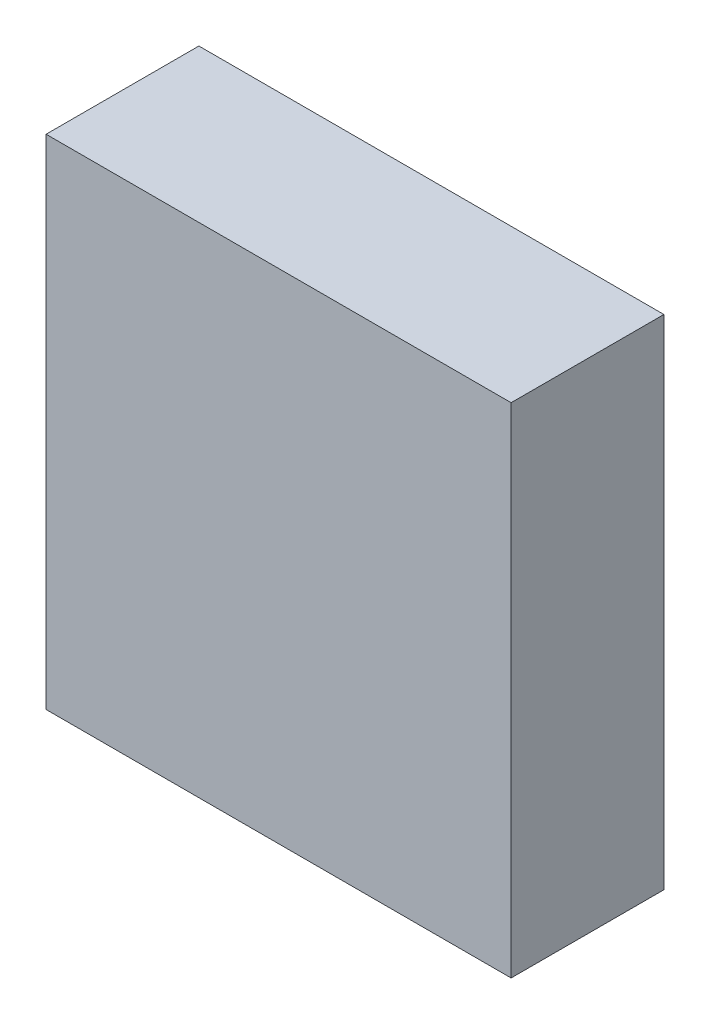
ISO-10303-21;
HEADER;
FILE_DESCRIPTION(('STEP AP214'),'2;1');
FILE_NAME('part.step','',(''),(''),'','','');
FILE_SCHEMA(('AUTOMOTIVE_DESIGN { 1 0 10303 214 1 1 1 1 }'));
ENDSEC;
DATA;
#1=APPLICATION_CONTEXT('core data for automotive mechanical design processes');
#2=APPLICATION_PROTOCOL_DEFINITION('international standard','automotive_design',2000,#1);
#3=PRODUCT_CONTEXT('',#1,'mechanical');
#4=PRODUCT('Part','Part','',(#3));
#5=PRODUCT_RELATED_PRODUCT_CATEGORY('part','',(#4));
#6=PRODUCT_DEFINITION_FORMATION('','',#4);
#7=PRODUCT_DEFINITION_CONTEXT('part definition',#1,'design');
#8=PRODUCT_DEFINITION('design','',#6,#7);
#9=PRODUCT_DEFINITION_SHAPE('','',#8);
#10=(LENGTH_UNIT() NAMED_UNIT(*) SI_UNIT(.MILLI.,.METRE.));
#11=(NAMED_UNIT(*) PLANE_ANGLE_UNIT() SI_UNIT($,.RADIAN.));
#12=(NAMED_UNIT(*) SI_UNIT($,.STERADIAN.) SOLID_ANGLE_UNIT());
#13=UNCERTAINTY_MEASURE_WITH_UNIT(LENGTH_MEASURE(1.E-05),#10,'distance_accuracy_value','');
#14=(GEOMETRIC_REPRESENTATION_CONTEXT(3) GLOBAL_UNCERTAINTY_ASSIGNED_CONTEXT((#13)) GLOBAL_UNIT_ASSIGNED_CONTEXT((#10,
#11,#12)) REPRESENTATION_CONTEXT('',''));
#15=CARTESIAN_POINT('',(0.,0.,0.));
#16=DIRECTION('',(0.,0.,1.));
#17=DIRECTION('',(1.,0.,0.));
#18=AXIS2_PLACEMENT_3D('',#15,#16,#17);
#19=CARTESIAN_POINT('',(-70.6631905284082,65.8326689774697,23.));
#20=DIRECTION('',(1.,0.,0.));
#21=DIRECTION('',(0.,1.,0.));
#22=AXIS2_PLACEMENT_3D('',#19,#20,#21);
#23=PLANE('',#22);
#24=DIRECTION('',(0.,-1.,0.));
#25=VECTOR('',#24,1.);
#26=CARTESIAN_POINT('',(-70.6631905284082,65.8326689774697,0.));
#27=LINE('',#26,#25);
#28=CARTESIAN_POINT('',(-70.6631905284082,65.8326689774697,0.));
#29=VERTEX_POINT('',#28);
#30=CARTESIAN_POINT('',(-70.6631905284081,-9.16733102253033,0.));
#31=VERTEX_POINT('',#30);
#32=EDGE_CURVE('E99',#29,#31,#27,.T.);
#33=ORIENTED_EDGE('',*,*,#32,.T.);
#34=DIRECTION('',(0.,0.,-1.));
#35=VECTOR('',#34,1.);
#36=CARTESIAN_POINT('',(-70.6631905284081,-9.16733102253033,23.));
#37=LINE('',#36,#35);
#38=CARTESIAN_POINT('',(-70.6631905284081,-9.16733102253033,23.));
#39=VERTEX_POINT('',#38);
#40=EDGE_CURVE('E11',#39,#31,#37,.T.);
#41=ORIENTED_EDGE('',*,*,#40,.F.);
#42=DIRECTION('',(0.,-1.,0.));
#43=VECTOR('',#42,1.);
#44=CARTESIAN_POINT('',(-70.6631905284082,65.8326689774697,23.));
#45=LINE('',#44,#43);
#46=CARTESIAN_POINT('',(-70.6631905284082,65.8326689774697,23.));
#47=VERTEX_POINT('',#46);
#48=EDGE_CURVE('E87',#47,#39,#45,.T.);
#49=ORIENTED_EDGE('',*,*,#48,.F.);
#50=DIRECTION('',(0.,0.,-1.));
#51=VECTOR('',#50,1.);
#52=CARTESIAN_POINT('',(-70.6631905284082,65.8326689774697,23.));
#53=LINE('',#52,#51);
#54=EDGE_CURVE('E95',#47,#29,#53,.T.);
#55=ORIENTED_EDGE('',*,*,#54,.T.);
#56=EDGE_LOOP('',(#33,#41,#49,#55));
#57=FACE_BOUND('',#56,.T.);
#58=ADVANCED_FACE('F36',(#57),#23,.F.);
#59=CARTESIAN_POINT('',(-70.6631905284081,-9.16733102253033,23.));
#60=DIRECTION('',(0.,1.,0.));
#61=DIRECTION('',(0.,0.,1.));
#62=AXIS2_PLACEMENT_3D('',#59,#60,#61);
#63=PLANE('',#62);
#64=DIRECTION('',(1.,0.,0.));
#65=VECTOR('',#64,1.);
#66=CARTESIAN_POINT('',(-70.6631905284081,-9.16733102253033,0.));
#67=LINE('',#66,#65);
#68=CARTESIAN_POINT('',(-0.663190528408131,-9.16733102253033,0.));
#69=VERTEX_POINT('',#68);
#70=EDGE_CURVE('E91',#31,#69,#67,.T.);
#71=ORIENTED_EDGE('',*,*,#70,.T.);
#72=DIRECTION('',(0.,0.,-1.));
#73=VECTOR('',#72,1.);
#74=CARTESIAN_POINT('',(-0.663190528408131,-9.16733102253033,23.));
#75=LINE('',#74,#73);
#76=CARTESIAN_POINT('',(-0.663190528408131,-9.16733102253033,23.));
#77=VERTEX_POINT('',#76);
#78=EDGE_CURVE('E44',#77,#69,#75,.T.);
#79=ORIENTED_EDGE('',*,*,#78,.F.);
#80=DIRECTION('',(1.,0.,0.));
#81=VECTOR('',#80,1.);
#82=CARTESIAN_POINT('',(-70.6631905284081,-9.16733102253033,23.));
#83=LINE('',#82,#81);
#84=EDGE_CURVE('E82',#39,#77,#83,.T.);
#85=ORIENTED_EDGE('',*,*,#84,.F.);
#86=ORIENTED_EDGE('',*,*,#40,.T.);
#87=EDGE_LOOP('',(#71,#79,#85,#86));
#88=FACE_BOUND('',#87,.T.);
#89=ADVANCED_FACE('F90',(#88),#63,.F.);
#90=CARTESIAN_POINT('',(-0.663190528408145,65.8326689774697,23.));
#91=DIRECTION('',(-1.,0.,0.));
#92=DIRECTION('',(0.,-1.,0.));
#93=AXIS2_PLACEMENT_3D('',#90,#91,#92);
#94=PLANE('',#93);
#95=DIRECTION('',(0.,1.,0.));
#96=VECTOR('',#95,1.);
#97=CARTESIAN_POINT('',(-0.663190528408145,65.8326689774697,0.));
#98=LINE('',#97,#96);
#99=CARTESIAN_POINT('',(-0.663190528408145,65.8326689774697,0.));
#100=VERTEX_POINT('',#99);
#101=EDGE_CURVE('E69',#69,#100,#98,.T.);
#102=ORIENTED_EDGE('',*,*,#101,.T.);
#103=DIRECTION('',(0.,0.,-1.));
#104=VECTOR('',#103,1.);
#105=CARTESIAN_POINT('',(-0.663190528408145,65.8326689774697,23.));
#106=LINE('',#105,#104);
#107=CARTESIAN_POINT('',(-0.663190528408145,65.8326689774697,23.));
#108=VERTEX_POINT('',#107);
#109=EDGE_CURVE('E92',#108,#100,#106,.T.);
#110=ORIENTED_EDGE('',*,*,#109,.F.);
#111=DIRECTION('',(0.,1.,0.));
#112=VECTOR('',#111,1.);
#113=CARTESIAN_POINT('',(-0.663190528408145,65.8326689774697,23.));
#114=LINE('',#113,#112);
#115=EDGE_CURVE('E85',#77,#108,#114,.T.);
#116=ORIENTED_EDGE('',*,*,#115,.F.);
#117=ORIENTED_EDGE('',*,*,#78,.T.);
#118=EDGE_LOOP('',(#102,#110,#116,#117));
#119=FACE_BOUND('',#118,.T.);
#120=ADVANCED_FACE('F93',(#119),#94,.F.);
#121=CARTESIAN_POINT('',(-70.6631905284082,65.8326689774697,23.));
#122=DIRECTION('',(0.,-1.,0.));
#123=DIRECTION('',(0.,0.,-1.));
#124=AXIS2_PLACEMENT_3D('',#121,#122,#123);
#125=PLANE('',#124);
#126=DIRECTION('',(-1.,0.,0.));
#127=VECTOR('',#126,1.);
#128=CARTESIAN_POINT('',(-70.6631905284082,65.8326689774697,0.));
#129=LINE('',#128,#127);
#130=EDGE_CURVE('E75',#100,#29,#129,.T.);
#131=ORIENTED_EDGE('',*,*,#130,.T.);
#132=ORIENTED_EDGE('',*,*,#54,.F.);
#133=DIRECTION('',(-1.,0.,0.));
#134=VECTOR('',#133,1.);
#135=CARTESIAN_POINT('',(-70.6631905284082,65.8326689774697,23.));
#136=LINE('',#135,#134);
#137=EDGE_CURVE('E52',#108,#47,#136,.T.);
#138=ORIENTED_EDGE('',*,*,#137,.F.);
#139=ORIENTED_EDGE('',*,*,#109,.T.);
#140=EDGE_LOOP('',(#131,#132,#138,#139));
#141=FACE_BOUND('',#140,.T.);
#142=ADVANCED_FACE('F106',(#141),#125,.F.);
#143=CARTESIAN_POINT('',(0.,0.,23.));
#144=DIRECTION('',(0.,0.,1.));
#145=DIRECTION('',(1.,0.,0.));
#146=AXIS2_PLACEMENT_3D('',#143,#144,#145);
#147=PLANE('',#146);
#148=ORIENTED_EDGE('',*,*,#48,.T.);
#149=ORIENTED_EDGE('',*,*,#84,.T.);
#150=ORIENTED_EDGE('',*,*,#115,.T.);
#151=ORIENTED_EDGE('',*,*,#137,.T.);
#152=EDGE_LOOP('',(#148,#149,#150,#151));
#153=FACE_BOUND('',#152,.T.);
#154=ADVANCED_FACE('F83',(#153),#147,.T.);
#155=CARTESIAN_POINT('',(0.,0.,0.));
#156=DIRECTION('',(0.,0.,1.));
#157=DIRECTION('',(1.,0.,0.));
#158=AXIS2_PLACEMENT_3D('',#155,#156,#157);
#159=PLANE('',#158);
#160=ORIENTED_EDGE('',*,*,#32,.F.);
#161=ORIENTED_EDGE('',*,*,#130,.F.);
#162=ORIENTED_EDGE('',*,*,#101,.F.);
#163=ORIENTED_EDGE('',*,*,#70,.F.);
#164=EDGE_LOOP('',(#160,#161,#162,#163));
#165=FACE_BOUND('',#164,.T.);
#166=ADVANCED_FACE('F109',(#165),#159,.F.);
#167=CLOSED_SHELL('',(#58,#89,#120,#142,#154,#166));
#168=MANIFOLD_SOLID_BREP('B2',#167);
#169=ADVANCED_BREP_SHAPE_REPRESENTATION('',(#18,#168),#14);
#170=SHAPE_DEFINITION_REPRESENTATION(#9,#169);
ENDSEC;
END-ISO-10303-21;
